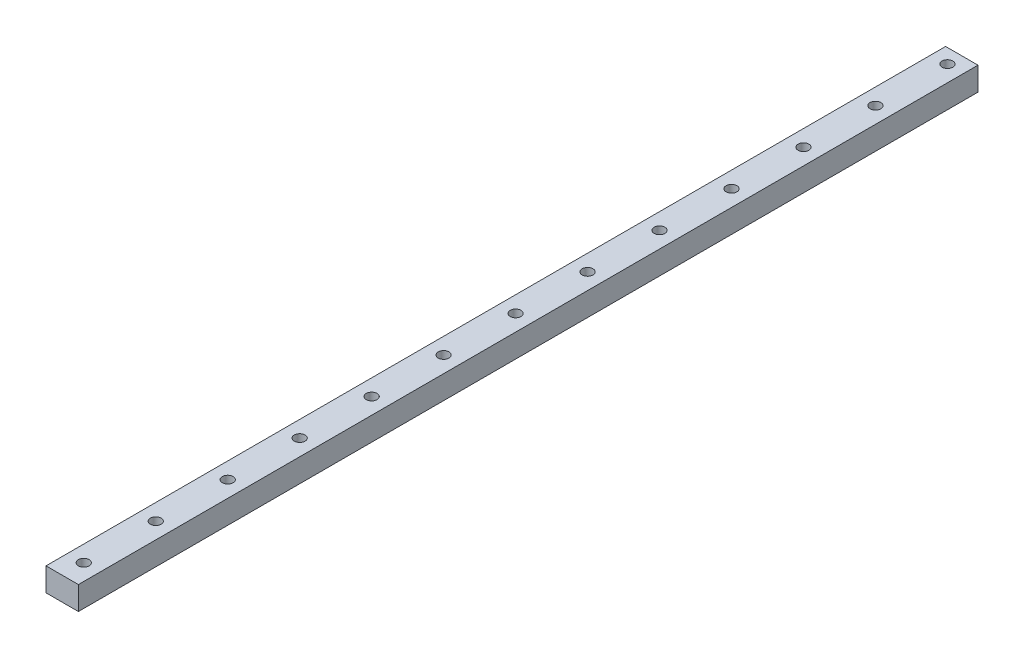
ISO-10303-21;
HEADER;
FILE_DESCRIPTION(('STEP AP214'),'2;1');
FILE_NAME('part.step','',(''),(''),'','','');
FILE_SCHEMA(('AUTOMOTIVE_DESIGN { 1 0 10303 214 1 1 1 1 }'));
ENDSEC;
DATA;
#1=APPLICATION_CONTEXT('core data for automotive mechanical design processes');
#2=APPLICATION_PROTOCOL_DEFINITION('international standard','automotive_design',2000,#1);
#3=PRODUCT_CONTEXT('',#1,'mechanical');
#4=PRODUCT('Part','Part','',(#3));
#5=PRODUCT_RELATED_PRODUCT_CATEGORY('part','',(#4));
#6=PRODUCT_DEFINITION_FORMATION('','',#4);
#7=PRODUCT_DEFINITION_CONTEXT('part definition',#1,'design');
#8=PRODUCT_DEFINITION('design','',#6,#7);
#9=PRODUCT_DEFINITION_SHAPE('','',#8);
#10=(LENGTH_UNIT() NAMED_UNIT(*) SI_UNIT(.MILLI.,.METRE.));
#11=(NAMED_UNIT(*) PLANE_ANGLE_UNIT() SI_UNIT($,.RADIAN.));
#12=(NAMED_UNIT(*) SI_UNIT($,.STERADIAN.) SOLID_ANGLE_UNIT());
#13=UNCERTAINTY_MEASURE_WITH_UNIT(LENGTH_MEASURE(1.E-05),#10,'distance_accuracy_value','');
#14=(GEOMETRIC_REPRESENTATION_CONTEXT(3) GLOBAL_UNCERTAINTY_ASSIGNED_CONTEXT((#13)) GLOBAL_UNIT_ASSIGNED_CONTEXT((#10,
#11,#12)) REPRESENTATION_CONTEXT('',''));
#15=CARTESIAN_POINT('',(0.,0.,0.));
#16=DIRECTION('',(0.,0.,1.));
#17=DIRECTION('',(1.,0.,0.));
#18=AXIS2_PLACEMENT_3D('',#15,#16,#17);
#19=CARTESIAN_POINT('',(4.5,3.25,250.));
#20=DIRECTION('',(-1.,0.,0.));
#21=DIRECTION('',(0.,-1.,0.));
#22=AXIS2_PLACEMENT_3D('',#19,#20,#21);
#23=PLANE('',#22);
#24=DIRECTION('',(0.,1.,0.));
#25=VECTOR('',#24,1.);
#26=CARTESIAN_POINT('',(4.5,3.25,0.));
#27=LINE('',#26,#25);
#28=CARTESIAN_POINT('',(4.5,-3.25,0.));
#29=VERTEX_POINT('',#28);
#30=CARTESIAN_POINT('',(4.5,3.25,0.));
#31=VERTEX_POINT('',#30);
#32=EDGE_CURVE('E114',#29,#31,#27,.T.);
#33=ORIENTED_EDGE('',*,*,#32,.T.);
#34=DIRECTION('',(0.,0.,-1.));
#35=VECTOR('',#34,1.);
#36=CARTESIAN_POINT('',(4.5,3.25,250.));
#37=LINE('',#36,#35);
#38=CARTESIAN_POINT('',(4.5,3.25,250.));
#39=VERTEX_POINT('',#38);
#40=EDGE_CURVE('E11',#39,#31,#37,.T.);
#41=ORIENTED_EDGE('',*,*,#40,.F.);
#42=DIRECTION('',(0.,1.,0.));
#43=VECTOR('',#42,1.);
#44=CARTESIAN_POINT('',(4.5,3.25,250.));
#45=LINE('',#44,#43);
#46=CARTESIAN_POINT('',(4.5,-3.25,250.));
#47=VERTEX_POINT('',#46);
#48=EDGE_CURVE('E97',#47,#39,#45,.T.);
#49=ORIENTED_EDGE('',*,*,#48,.F.);
#50=DIRECTION('',(0.,0.,-1.));
#51=VECTOR('',#50,1.);
#52=CARTESIAN_POINT('',(4.5,-3.25,250.));
#53=LINE('',#52,#51);
#54=EDGE_CURVE('E110',#47,#29,#53,.T.);
#55=ORIENTED_EDGE('',*,*,#54,.T.);
#56=EDGE_LOOP('',(#33,#41,#49,#55));
#57=FACE_BOUND('',#56,.T.);
#58=ADVANCED_FACE('F43',(#57),#23,.F.);
#59=CARTESIAN_POINT('',(-4.5,3.25,250.));
#60=DIRECTION('',(0.,-1.,0.));
#61=DIRECTION('',(0.,0.,-1.));
#62=AXIS2_PLACEMENT_3D('',#59,#60,#61);
#63=PLANE('',#62);
#64=CARTESIAN_POINT('',(0.,3.25,4.));
#65=DIRECTION('',(0.,1.,0.));
#66=DIRECTION('',(0.,0.,1.));
#67=AXIS2_PLACEMENT_3D('',#64,#65,#66);
#68=CIRCLE('',#67,1.5);
#69=CARTESIAN_POINT('',(0.,3.25,5.5));
#70=VERTEX_POINT('',#69);
#71=EDGE_CURVE('E133',#70,#70,#68,.T.);
#72=ORIENTED_EDGE('',*,*,#71,.F.);
#73=EDGE_LOOP('',(#72));
#74=FACE_BOUND('',#73,.T.);
#75=CARTESIAN_POINT('',(0.,3.25,24.));
#76=DIRECTION('',(0.,1.,0.));
#77=DIRECTION('',(0.,0.,1.));
#78=AXIS2_PLACEMENT_3D('',#75,#76,#77);
#79=CIRCLE('',#78,1.5);
#80=CARTESIAN_POINT('',(0.,3.25,25.5));
#81=VERTEX_POINT('',#80);
#82=EDGE_CURVE('E439',#81,#81,#79,.T.);
#83=ORIENTED_EDGE('',*,*,#82,.F.);
#84=EDGE_LOOP('',(#83));
#85=FACE_BOUND('',#84,.T.);
#86=CARTESIAN_POINT('',(0.,3.25,44.));
#87=DIRECTION('',(0.,1.,0.));
#88=DIRECTION('',(0.,0.,1.));
#89=AXIS2_PLACEMENT_3D('',#86,#87,#88);
#90=CIRCLE('',#89,1.5);
#91=CARTESIAN_POINT('',(0.,3.25,45.5));
#92=VERTEX_POINT('',#91);
#93=EDGE_CURVE('E404',#92,#92,#90,.T.);
#94=ORIENTED_EDGE('',*,*,#93,.F.);
#95=EDGE_LOOP('',(#94));
#96=FACE_BOUND('',#95,.T.);
#97=CARTESIAN_POINT('',(0.,3.25,64.));
#98=DIRECTION('',(0.,1.,0.));
#99=DIRECTION('',(0.,0.,1.));
#100=AXIS2_PLACEMENT_3D('',#97,#98,#99);
#101=CIRCLE('',#100,1.5);
#102=CARTESIAN_POINT('',(0.,3.25,65.5));
#103=VERTEX_POINT('',#102);
#104=EDGE_CURVE('E440',#103,#103,#101,.T.);
#105=ORIENTED_EDGE('',*,*,#104,.F.);
#106=EDGE_LOOP('',(#105));
#107=FACE_BOUND('',#106,.T.);
#108=CARTESIAN_POINT('',(0.,3.25,84.));
#109=DIRECTION('',(0.,1.,0.));
#110=DIRECTION('',(0.,0.,1.));
#111=AXIS2_PLACEMENT_3D('',#108,#109,#110);
#112=CIRCLE('',#111,1.5);
#113=CARTESIAN_POINT('',(0.,3.25,85.5));
#114=VERTEX_POINT('',#113);
#115=EDGE_CURVE('E447',#114,#114,#112,.T.);
#116=ORIENTED_EDGE('',*,*,#115,.F.);
#117=EDGE_LOOP('',(#116));
#118=FACE_BOUND('',#117,.T.);
#119=CARTESIAN_POINT('',(0.,3.25,104.));
#120=DIRECTION('',(0.,1.,0.));
#121=DIRECTION('',(0.,0.,1.));
#122=AXIS2_PLACEMENT_3D('',#119,#120,#121);
#123=CIRCLE('',#122,1.5);
#124=CARTESIAN_POINT('',(0.,3.25,105.5));
#125=VERTEX_POINT('',#124);
#126=EDGE_CURVE('E454',#125,#125,#123,.T.);
#127=ORIENTED_EDGE('',*,*,#126,.F.);
#128=EDGE_LOOP('',(#127));
#129=FACE_BOUND('',#128,.T.);
#130=CARTESIAN_POINT('',(0.,3.25,124.));
#131=DIRECTION('',(0.,1.,0.));
#132=DIRECTION('',(0.,0.,1.));
#133=AXIS2_PLACEMENT_3D('',#130,#131,#132);
#134=CIRCLE('',#133,1.5);
#135=CARTESIAN_POINT('',(0.,3.25,125.5));
#136=VERTEX_POINT('',#135);
#137=EDGE_CURVE('E458',#136,#136,#134,.T.);
#138=ORIENTED_EDGE('',*,*,#137,.F.);
#139=EDGE_LOOP('',(#138));
#140=FACE_BOUND('',#139,.T.);
#141=CARTESIAN_POINT('',(0.,3.25,144.));
#142=DIRECTION('',(0.,1.,0.));
#143=DIRECTION('',(0.,0.,1.));
#144=AXIS2_PLACEMENT_3D('',#141,#142,#143);
#145=CIRCLE('',#144,1.5);
#146=CARTESIAN_POINT('',(0.,3.25,145.5));
#147=VERTEX_POINT('',#146);
#148=EDGE_CURVE('E462',#147,#147,#145,.T.);
#149=ORIENTED_EDGE('',*,*,#148,.F.);
#150=EDGE_LOOP('',(#149));
#151=FACE_BOUND('',#150,.T.);
#152=CARTESIAN_POINT('',(0.,3.25,164.));
#153=DIRECTION('',(0.,1.,0.));
#154=DIRECTION('',(0.,0.,1.));
#155=AXIS2_PLACEMENT_3D('',#152,#153,#154);
#156=CIRCLE('',#155,1.5);
#157=CARTESIAN_POINT('',(0.,3.25,165.5));
#158=VERTEX_POINT('',#157);
#159=EDGE_CURVE('E466',#158,#158,#156,.T.);
#160=ORIENTED_EDGE('',*,*,#159,.F.);
#161=EDGE_LOOP('',(#160));
#162=FACE_BOUND('',#161,.T.);
#163=CARTESIAN_POINT('',(0.,3.25,184.));
#164=DIRECTION('',(0.,1.,0.));
#165=DIRECTION('',(0.,0.,1.));
#166=AXIS2_PLACEMENT_3D('',#163,#164,#165);
#167=CIRCLE('',#166,1.5);
#168=CARTESIAN_POINT('',(0.,3.25,185.5));
#169=VERTEX_POINT('',#168);
#170=EDGE_CURVE('E470',#169,#169,#167,.T.);
#171=ORIENTED_EDGE('',*,*,#170,.F.);
#172=EDGE_LOOP('',(#171));
#173=FACE_BOUND('',#172,.T.);
#174=CARTESIAN_POINT('',(0.,3.25,204.));
#175=DIRECTION('',(0.,1.,0.));
#176=DIRECTION('',(0.,0.,1.));
#177=AXIS2_PLACEMENT_3D('',#174,#175,#176);
#178=CIRCLE('',#177,1.5);
#179=CARTESIAN_POINT('',(0.,3.25,205.5));
#180=VERTEX_POINT('',#179);
#181=EDGE_CURVE('E474',#180,#180,#178,.T.);
#182=ORIENTED_EDGE('',*,*,#181,.F.);
#183=EDGE_LOOP('',(#182));
#184=FACE_BOUND('',#183,.T.);
#185=CARTESIAN_POINT('',(0.,3.25,224.));
#186=DIRECTION('',(0.,1.,0.));
#187=DIRECTION('',(0.,0.,1.));
#188=AXIS2_PLACEMENT_3D('',#185,#186,#187);
#189=CIRCLE('',#188,1.5);
#190=CARTESIAN_POINT('',(0.,3.25,225.5));
#191=VERTEX_POINT('',#190);
#192=EDGE_CURVE('E478',#191,#191,#189,.T.);
#193=ORIENTED_EDGE('',*,*,#192,.F.);
#194=EDGE_LOOP('',(#193));
#195=FACE_BOUND('',#194,.T.);
#196=CARTESIAN_POINT('',(0.,3.25,244.));
#197=DIRECTION('',(0.,1.,0.));
#198=DIRECTION('',(0.,0.,1.));
#199=AXIS2_PLACEMENT_3D('',#196,#197,#198);
#200=CIRCLE('',#199,1.5);
#201=CARTESIAN_POINT('',(0.,3.25,245.5));
#202=VERTEX_POINT('',#201);
#203=EDGE_CURVE('E482',#202,#202,#200,.T.);
#204=ORIENTED_EDGE('',*,*,#203,.F.);
#205=EDGE_LOOP('',(#204));
#206=FACE_BOUND('',#205,.T.);
#207=DIRECTION('',(-1.,0.,0.));
#208=VECTOR('',#207,1.);
#209=CARTESIAN_POINT('',(-4.5,3.25,0.));
#210=LINE('',#209,#208);
#211=CARTESIAN_POINT('',(-4.5,3.25,0.));
#212=VERTEX_POINT('',#211);
#213=EDGE_CURVE('E102',#31,#212,#210,.T.);
#214=ORIENTED_EDGE('',*,*,#213,.T.);
#215=DIRECTION('',(0.,0.,-1.));
#216=VECTOR('',#215,1.);
#217=CARTESIAN_POINT('',(-4.5,3.25,250.));
#218=LINE('',#217,#216);
#219=CARTESIAN_POINT('',(-4.5,3.25,250.));
#220=VERTEX_POINT('',#219);
#221=EDGE_CURVE('E53',#220,#212,#218,.T.);
#222=ORIENTED_EDGE('',*,*,#221,.F.);
#223=DIRECTION('',(-1.,0.,0.));
#224=VECTOR('',#223,1.);
#225=CARTESIAN_POINT('',(-4.5,3.25,250.));
#226=LINE('',#225,#224);
#227=EDGE_CURVE('E92',#39,#220,#226,.T.);
#228=ORIENTED_EDGE('',*,*,#227,.F.);
#229=ORIENTED_EDGE('',*,*,#40,.T.);
#230=EDGE_LOOP('',(#214,#222,#228,#229));
#231=FACE_BOUND('',#230,.T.);
#232=ADVANCED_FACE('F101',(#74,#85,#96,#107,#118,#129,#140,#151,#162,#173,#184,#195,#206,#231),
#63,.F.);
#233=CARTESIAN_POINT('',(-4.5,3.25,250.));
#234=DIRECTION('',(1.,0.,0.));
#235=DIRECTION('',(0.,1.,0.));
#236=AXIS2_PLACEMENT_3D('',#233,#234,#235);
#237=PLANE('',#236);
#238=DIRECTION('',(0.,-1.,0.));
#239=VECTOR('',#238,1.);
#240=CARTESIAN_POINT('',(-4.5,3.25,0.));
#241=LINE('',#240,#239);
#242=CARTESIAN_POINT('',(-4.5,-3.25,0.));
#243=VERTEX_POINT('',#242);
#244=EDGE_CURVE('E79',#212,#243,#241,.T.);
#245=ORIENTED_EDGE('',*,*,#244,.T.);
#246=DIRECTION('',(0.,0.,-1.));
#247=VECTOR('',#246,1.);
#248=CARTESIAN_POINT('',(-4.5,-3.25,250.));
#249=LINE('',#248,#247);
#250=CARTESIAN_POINT('',(-4.5,-3.25,250.));
#251=VERTEX_POINT('',#250);
#252=EDGE_CURVE('E104',#251,#243,#249,.T.);
#253=ORIENTED_EDGE('',*,*,#252,.F.);
#254=DIRECTION('',(0.,-1.,0.));
#255=VECTOR('',#254,1.);
#256=CARTESIAN_POINT('',(-4.5,3.25,250.));
#257=LINE('',#256,#255);
#258=EDGE_CURVE('E95',#220,#251,#257,.T.);
#259=ORIENTED_EDGE('',*,*,#258,.F.);
#260=ORIENTED_EDGE('',*,*,#221,.T.);
#261=EDGE_LOOP('',(#245,#253,#259,#260));
#262=FACE_BOUND('',#261,.T.);
#263=ADVANCED_FACE('F106',(#262),#237,.F.);
#264=CARTESIAN_POINT('',(-4.5,-3.25,250.));
#265=DIRECTION('',(0.,1.,0.));
#266=DIRECTION('',(0.,0.,1.));
#267=AXIS2_PLACEMENT_3D('',#264,#265,#266);
#268=PLANE('',#267);
#269=CARTESIAN_POINT('',(0.,-3.25,4.));
#270=DIRECTION('',(0.,1.,0.));
#271=DIRECTION('',(0.,0.,1.));
#272=AXIS2_PLACEMENT_3D('',#269,#270,#271);
#273=CIRCLE('',#272,1.5);
#274=CARTESIAN_POINT('',(0.,-3.25,5.5));
#275=VERTEX_POINT('',#274);
#276=EDGE_CURVE('E46',#275,#275,#273,.T.);
#277=ORIENTED_EDGE('',*,*,#276,.T.);
#278=EDGE_LOOP('',(#277));
#279=FACE_BOUND('',#278,.T.);
#280=CARTESIAN_POINT('',(0.,-3.25,24.));
#281=DIRECTION('',(0.,1.,0.));
#282=DIRECTION('',(0.,0.,1.));
#283=AXIS2_PLACEMENT_3D('',#280,#281,#282);
#284=CIRCLE('',#283,1.5);
#285=CARTESIAN_POINT('',(0.,-3.25,25.5));
#286=VERTEX_POINT('',#285);
#287=EDGE_CURVE('E172',#286,#286,#284,.T.);
#288=ORIENTED_EDGE('',*,*,#287,.T.);
#289=EDGE_LOOP('',(#288));
#290=FACE_BOUND('',#289,.T.);
#291=CARTESIAN_POINT('',(0.,-3.25,44.));
#292=DIRECTION('',(0.,1.,0.));
#293=DIRECTION('',(0.,0.,1.));
#294=AXIS2_PLACEMENT_3D('',#291,#292,#293);
#295=CIRCLE('',#294,1.5);
#296=CARTESIAN_POINT('',(0.,-3.25,45.5));
#297=VERTEX_POINT('',#296);
#298=EDGE_CURVE('E169',#297,#297,#295,.T.);
#299=ORIENTED_EDGE('',*,*,#298,.T.);
#300=EDGE_LOOP('',(#299));
#301=FACE_BOUND('',#300,.T.);
#302=CARTESIAN_POINT('',(0.,-3.25,64.));
#303=DIRECTION('',(0.,1.,0.));
#304=DIRECTION('',(0.,0.,1.));
#305=AXIS2_PLACEMENT_3D('',#302,#303,#304);
#306=CIRCLE('',#305,1.5);
#307=CARTESIAN_POINT('',(0.,-3.25,65.5));
#308=VERTEX_POINT('',#307);
#309=EDGE_CURVE('E165',#308,#308,#306,.T.);
#310=ORIENTED_EDGE('',*,*,#309,.T.);
#311=EDGE_LOOP('',(#310));
#312=FACE_BOUND('',#311,.T.);
#313=CARTESIAN_POINT('',(0.,-3.25,84.));
#314=DIRECTION('',(0.,1.,0.));
#315=DIRECTION('',(0.,0.,1.));
#316=AXIS2_PLACEMENT_3D('',#313,#314,#315);
#317=CIRCLE('',#316,1.5);
#318=CARTESIAN_POINT('',(0.,-3.25,85.5));
#319=VERTEX_POINT('',#318);
#320=EDGE_CURVE('E161',#319,#319,#317,.T.);
#321=ORIENTED_EDGE('',*,*,#320,.T.);
#322=EDGE_LOOP('',(#321));
#323=FACE_BOUND('',#322,.T.);
#324=CARTESIAN_POINT('',(0.,-3.25,104.));
#325=DIRECTION('',(0.,1.,0.));
#326=DIRECTION('',(0.,0.,1.));
#327=AXIS2_PLACEMENT_3D('',#324,#325,#326);
#328=CIRCLE('',#327,1.5);
#329=CARTESIAN_POINT('',(0.,-3.25,105.5));
#330=VERTEX_POINT('',#329);
#331=EDGE_CURVE('E157',#330,#330,#328,.T.);
#332=ORIENTED_EDGE('',*,*,#331,.T.);
#333=EDGE_LOOP('',(#332));
#334=FACE_BOUND('',#333,.T.);
#335=CARTESIAN_POINT('',(0.,-3.25,124.));
#336=DIRECTION('',(0.,1.,0.));
#337=DIRECTION('',(0.,0.,1.));
#338=AXIS2_PLACEMENT_3D('',#335,#336,#337);
#339=CIRCLE('',#338,1.5);
#340=CARTESIAN_POINT('',(0.,-3.25,125.5));
#341=VERTEX_POINT('',#340);
#342=EDGE_CURVE('E153',#341,#341,#339,.T.);
#343=ORIENTED_EDGE('',*,*,#342,.T.);
#344=EDGE_LOOP('',(#343));
#345=FACE_BOUND('',#344,.T.);
#346=CARTESIAN_POINT('',(0.,-3.25,144.));
#347=DIRECTION('',(0.,1.,0.));
#348=DIRECTION('',(0.,0.,1.));
#349=AXIS2_PLACEMENT_3D('',#346,#347,#348);
#350=CIRCLE('',#349,1.5);
#351=CARTESIAN_POINT('',(0.,-3.25,145.5));
#352=VERTEX_POINT('',#351);
#353=EDGE_CURVE('E149',#352,#352,#350,.T.);
#354=ORIENTED_EDGE('',*,*,#353,.T.);
#355=EDGE_LOOP('',(#354));
#356=FACE_BOUND('',#355,.T.);
#357=CARTESIAN_POINT('',(0.,-3.25,164.));
#358=DIRECTION('',(0.,1.,0.));
#359=DIRECTION('',(0.,0.,1.));
#360=AXIS2_PLACEMENT_3D('',#357,#358,#359);
#361=CIRCLE('',#360,1.5);
#362=CARTESIAN_POINT('',(0.,-3.25,165.5));
#363=VERTEX_POINT('',#362);
#364=EDGE_CURVE('E145',#363,#363,#361,.T.);
#365=ORIENTED_EDGE('',*,*,#364,.T.);
#366=EDGE_LOOP('',(#365));
#367=FACE_BOUND('',#366,.T.);
#368=CARTESIAN_POINT('',(0.,-3.25,184.));
#369=DIRECTION('',(0.,1.,0.));
#370=DIRECTION('',(0.,0.,1.));
#371=AXIS2_PLACEMENT_3D('',#368,#369,#370);
#372=CIRCLE('',#371,1.5);
#373=CARTESIAN_POINT('',(0.,-3.25,185.5));
#374=VERTEX_POINT('',#373);
#375=EDGE_CURVE('E141',#374,#374,#372,.T.);
#376=ORIENTED_EDGE('',*,*,#375,.T.);
#377=EDGE_LOOP('',(#376));
#378=FACE_BOUND('',#377,.T.);
#379=CARTESIAN_POINT('',(0.,-3.25,204.));
#380=DIRECTION('',(0.,1.,0.));
#381=DIRECTION('',(0.,0.,1.));
#382=AXIS2_PLACEMENT_3D('',#379,#380,#381);
#383=CIRCLE('',#382,1.5);
#384=CARTESIAN_POINT('',(0.,-3.25,205.5));
#385=VERTEX_POINT('',#384);
#386=EDGE_CURVE('E137',#385,#385,#383,.T.);
#387=ORIENTED_EDGE('',*,*,#386,.T.);
#388=EDGE_LOOP('',(#387));
#389=FACE_BOUND('',#388,.T.);
#390=CARTESIAN_POINT('',(0.,-3.25,224.));
#391=DIRECTION('',(0.,1.,0.));
#392=DIRECTION('',(0.,0.,1.));
#393=AXIS2_PLACEMENT_3D('',#390,#391,#392);
#394=CIRCLE('',#393,1.5);
#395=CARTESIAN_POINT('',(0.,-3.25,225.5));
#396=VERTEX_POINT('',#395);
#397=EDGE_CURVE('E132',#396,#396,#394,.T.);
#398=ORIENTED_EDGE('',*,*,#397,.T.);
#399=EDGE_LOOP('',(#398));
#400=FACE_BOUND('',#399,.T.);
#401=CARTESIAN_POINT('',(0.,-3.25,244.));
#402=DIRECTION('',(0.,1.,0.));
#403=DIRECTION('',(0.,0.,1.));
#404=AXIS2_PLACEMENT_3D('',#401,#402,#403);
#405=CIRCLE('',#404,1.5);
#406=CARTESIAN_POINT('',(0.,-3.25,245.5));
#407=VERTEX_POINT('',#406);
#408=EDGE_CURVE('E128',#407,#407,#405,.T.);
#409=ORIENTED_EDGE('',*,*,#408,.T.);
#410=EDGE_LOOP('',(#409));
#411=FACE_BOUND('',#410,.T.);
#412=DIRECTION('',(1.,0.,0.));
#413=VECTOR('',#412,1.);
#414=CARTESIAN_POINT('',(-4.5,-3.25,0.));
#415=LINE('',#414,#413);
#416=EDGE_CURVE('E85',#243,#29,#415,.T.);
#417=ORIENTED_EDGE('',*,*,#416,.T.);
#418=ORIENTED_EDGE('',*,*,#54,.F.);
#419=DIRECTION('',(1.,0.,0.));
#420=VECTOR('',#419,1.);
#421=CARTESIAN_POINT('',(-4.5,-3.25,250.));
#422=LINE('',#421,#420);
#423=EDGE_CURVE('E62',#251,#47,#422,.T.);
#424=ORIENTED_EDGE('',*,*,#423,.F.);
#425=ORIENTED_EDGE('',*,*,#252,.T.);
#426=EDGE_LOOP('',(#417,#418,#424,#425));
#427=FACE_BOUND('',#426,.T.);
#428=ADVANCED_FACE('F181',(#279,#290,#301,#312,#323,#334,#345,#356,#367,#378,#389,#400,#411,
#427),#268,.F.);
#429=CARTESIAN_POINT('',(0.,0.,250.));
#430=DIRECTION('',(0.,0.,1.));
#431=DIRECTION('',(1.,0.,0.));
#432=AXIS2_PLACEMENT_3D('',#429,#430,#431);
#433=PLANE('',#432);
#434=ORIENTED_EDGE('',*,*,#48,.T.);
#435=ORIENTED_EDGE('',*,*,#227,.T.);
#436=ORIENTED_EDGE('',*,*,#258,.T.);
#437=ORIENTED_EDGE('',*,*,#423,.T.);
#438=EDGE_LOOP('',(#434,#435,#436,#437));
#439=FACE_BOUND('',#438,.T.);
#440=ADVANCED_FACE('F93',(#439),#433,.T.);
#441=CARTESIAN_POINT('',(0.,0.,0.));
#442=DIRECTION('',(0.,0.,1.));
#443=DIRECTION('',(1.,0.,0.));
#444=AXIS2_PLACEMENT_3D('',#441,#442,#443);
#445=PLANE('',#444);
#446=ORIENTED_EDGE('',*,*,#32,.F.);
#447=ORIENTED_EDGE('',*,*,#416,.F.);
#448=ORIENTED_EDGE('',*,*,#244,.F.);
#449=ORIENTED_EDGE('',*,*,#213,.F.);
#450=EDGE_LOOP('',(#446,#447,#448,#449));
#451=FACE_BOUND('',#450,.T.);
#452=ADVANCED_FACE('F203',(#451),#445,.F.);
#453=CARTESIAN_POINT('',(0.,-246.75,244.));
#454=DIRECTION('',(0.,1.,0.));
#455=DIRECTION('',(0.,0.,1.));
#456=AXIS2_PLACEMENT_3D('',#453,#454,#455);
#457=CYLINDRICAL_SURFACE('',#456,1.5);
#458=ORIENTED_EDGE('',*,*,#203,.T.);
#459=EDGE_LOOP('',(#458));
#460=FACE_BOUND('',#459,.T.);
#461=ORIENTED_EDGE('',*,*,#408,.F.);
#462=EDGE_LOOP('',(#461));
#463=FACE_BOUND('',#462,.T.);
#464=ADVANCED_FACE('F205',(#460,#463),#457,.F.);
#465=CARTESIAN_POINT('',(0.,-246.75,224.));
#466=DIRECTION('',(0.,1.,0.));
#467=DIRECTION('',(0.,0.,1.));
#468=AXIS2_PLACEMENT_3D('',#465,#466,#467);
#469=CYLINDRICAL_SURFACE('',#468,1.5);
#470=ORIENTED_EDGE('',*,*,#192,.T.);
#471=EDGE_LOOP('',(#470));
#472=FACE_BOUND('',#471,.T.);
#473=ORIENTED_EDGE('',*,*,#397,.F.);
#474=EDGE_LOOP('',(#473));
#475=FACE_BOUND('',#474,.T.);
#476=ADVANCED_FACE('F211',(#472,#475),#469,.F.);
#477=CARTESIAN_POINT('',(0.,-246.75,204.));
#478=DIRECTION('',(0.,1.,0.));
#479=DIRECTION('',(0.,0.,1.));
#480=AXIS2_PLACEMENT_3D('',#477,#478,#479);
#481=CYLINDRICAL_SURFACE('',#480,1.5);
#482=ORIENTED_EDGE('',*,*,#181,.T.);
#483=EDGE_LOOP('',(#482));
#484=FACE_BOUND('',#483,.T.);
#485=ORIENTED_EDGE('',*,*,#386,.F.);
#486=EDGE_LOOP('',(#485));
#487=FACE_BOUND('',#486,.T.);
#488=ADVANCED_FACE('F272',(#484,#487),#481,.F.);
#489=CARTESIAN_POINT('',(0.,-246.75,184.));
#490=DIRECTION('',(0.,1.,0.));
#491=DIRECTION('',(0.,0.,1.));
#492=AXIS2_PLACEMENT_3D('',#489,#490,#491);
#493=CYLINDRICAL_SURFACE('',#492,1.5);
#494=ORIENTED_EDGE('',*,*,#170,.T.);
#495=EDGE_LOOP('',(#494));
#496=FACE_BOUND('',#495,.T.);
#497=ORIENTED_EDGE('',*,*,#375,.F.);
#498=EDGE_LOOP('',(#497));
#499=FACE_BOUND('',#498,.T.);
#500=ADVANCED_FACE('F282',(#496,#499),#493,.F.);
#501=CARTESIAN_POINT('',(0.,-246.75,164.));
#502=DIRECTION('',(0.,1.,0.));
#503=DIRECTION('',(0.,0.,1.));
#504=AXIS2_PLACEMENT_3D('',#501,#502,#503);
#505=CYLINDRICAL_SURFACE('',#504,1.5);
#506=ORIENTED_EDGE('',*,*,#159,.T.);
#507=EDGE_LOOP('',(#506));
#508=FACE_BOUND('',#507,.T.);
#509=ORIENTED_EDGE('',*,*,#364,.F.);
#510=EDGE_LOOP('',(#509));
#511=FACE_BOUND('',#510,.T.);
#512=ADVANCED_FACE('F292',(#508,#511),#505,.F.);
#513=CARTESIAN_POINT('',(0.,-246.75,144.));
#514=DIRECTION('',(0.,1.,0.));
#515=DIRECTION('',(0.,0.,1.));
#516=AXIS2_PLACEMENT_3D('',#513,#514,#515);
#517=CYLINDRICAL_SURFACE('',#516,1.5);
#518=ORIENTED_EDGE('',*,*,#148,.T.);
#519=EDGE_LOOP('',(#518));
#520=FACE_BOUND('',#519,.T.);
#521=ORIENTED_EDGE('',*,*,#353,.F.);
#522=EDGE_LOOP('',(#521));
#523=FACE_BOUND('',#522,.T.);
#524=ADVANCED_FACE('F302',(#520,#523),#517,.F.);
#525=CARTESIAN_POINT('',(0.,-246.75,124.));
#526=DIRECTION('',(0.,1.,0.));
#527=DIRECTION('',(0.,0.,1.));
#528=AXIS2_PLACEMENT_3D('',#525,#526,#527);
#529=CYLINDRICAL_SURFACE('',#528,1.5);
#530=ORIENTED_EDGE('',*,*,#137,.T.);
#531=EDGE_LOOP('',(#530));
#532=FACE_BOUND('',#531,.T.);
#533=ORIENTED_EDGE('',*,*,#342,.F.);
#534=EDGE_LOOP('',(#533));
#535=FACE_BOUND('',#534,.T.);
#536=ADVANCED_FACE('F312',(#532,#535),#529,.F.);
#537=CARTESIAN_POINT('',(0.,-246.75,104.));
#538=DIRECTION('',(0.,1.,0.));
#539=DIRECTION('',(0.,0.,1.));
#540=AXIS2_PLACEMENT_3D('',#537,#538,#539);
#541=CYLINDRICAL_SURFACE('',#540,1.5);
#542=ORIENTED_EDGE('',*,*,#126,.T.);
#543=EDGE_LOOP('',(#542));
#544=FACE_BOUND('',#543,.T.);
#545=ORIENTED_EDGE('',*,*,#331,.F.);
#546=EDGE_LOOP('',(#545));
#547=FACE_BOUND('',#546,.T.);
#548=ADVANCED_FACE('F322',(#544,#547),#541,.F.);
#549=CARTESIAN_POINT('',(0.,-246.75,84.));
#550=DIRECTION('',(0.,1.,0.));
#551=DIRECTION('',(0.,0.,1.));
#552=AXIS2_PLACEMENT_3D('',#549,#550,#551);
#553=CYLINDRICAL_SURFACE('',#552,1.5);
#554=ORIENTED_EDGE('',*,*,#115,.T.);
#555=EDGE_LOOP('',(#554));
#556=FACE_BOUND('',#555,.T.);
#557=ORIENTED_EDGE('',*,*,#320,.F.);
#558=EDGE_LOOP('',(#557));
#559=FACE_BOUND('',#558,.T.);
#560=ADVANCED_FACE('F332',(#556,#559),#553,.F.);
#561=CARTESIAN_POINT('',(0.,-246.75,64.));
#562=DIRECTION('',(0.,1.,0.));
#563=DIRECTION('',(0.,0.,1.));
#564=AXIS2_PLACEMENT_3D('',#561,#562,#563);
#565=CYLINDRICAL_SURFACE('',#564,1.5);
#566=ORIENTED_EDGE('',*,*,#104,.T.);
#567=EDGE_LOOP('',(#566));
#568=FACE_BOUND('',#567,.T.);
#569=ORIENTED_EDGE('',*,*,#309,.F.);
#570=EDGE_LOOP('',(#569));
#571=FACE_BOUND('',#570,.T.);
#572=ADVANCED_FACE('F342',(#568,#571),#565,.F.);
#573=CARTESIAN_POINT('',(0.,-246.75,44.));
#574=DIRECTION('',(0.,1.,0.));
#575=DIRECTION('',(0.,0.,1.));
#576=AXIS2_PLACEMENT_3D('',#573,#574,#575);
#577=CYLINDRICAL_SURFACE('',#576,1.5);
#578=ORIENTED_EDGE('',*,*,#93,.T.);
#579=EDGE_LOOP('',(#578));
#580=FACE_BOUND('',#579,.T.);
#581=ORIENTED_EDGE('',*,*,#298,.F.);
#582=EDGE_LOOP('',(#581));
#583=FACE_BOUND('',#582,.T.);
#584=ADVANCED_FACE('F191',(#580,#583),#577,.F.);
#585=CARTESIAN_POINT('',(0.,-246.75,24.));
#586=DIRECTION('',(0.,1.,0.));
#587=DIRECTION('',(0.,0.,1.));
#588=AXIS2_PLACEMENT_3D('',#585,#586,#587);
#589=CYLINDRICAL_SURFACE('',#588,1.5);
#590=ORIENTED_EDGE('',*,*,#82,.T.);
#591=EDGE_LOOP('',(#590));
#592=FACE_BOUND('',#591,.T.);
#593=ORIENTED_EDGE('',*,*,#287,.F.);
#594=EDGE_LOOP('',(#593));
#595=FACE_BOUND('',#594,.T.);
#596=ADVANCED_FACE('F185',(#592,#595),#589,.F.);
#597=CARTESIAN_POINT('',(0.,-246.75,4.));
#598=DIRECTION('',(0.,1.,0.));
#599=DIRECTION('',(0.,0.,1.));
#600=AXIS2_PLACEMENT_3D('',#597,#598,#599);
#601=CYLINDRICAL_SURFACE('',#600,1.5);
#602=ORIENTED_EDGE('',*,*,#71,.T.);
#603=EDGE_LOOP('',(#602));
#604=FACE_BOUND('',#603,.T.);
#605=ORIENTED_EDGE('',*,*,#276,.F.);
#606=EDGE_LOOP('',(#605));
#607=FACE_BOUND('',#606,.T.);
#608=ADVANCED_FACE('F183',(#604,#607),#601,.F.);
#609=CLOSED_SHELL('',(#58,#232,#263,#428,#440,#452,#464,#476,#488,#500,#512,#524,#536,#548,#560,
#572,#584,#596,#608));
#610=MANIFOLD_SOLID_BREP('B2',#609);
#611=ADVANCED_BREP_SHAPE_REPRESENTATION('',(#18,#610),#14);
#612=SHAPE_DEFINITION_REPRESENTATION(#9,#611);
ENDSEC;
END-ISO-10303-21;
